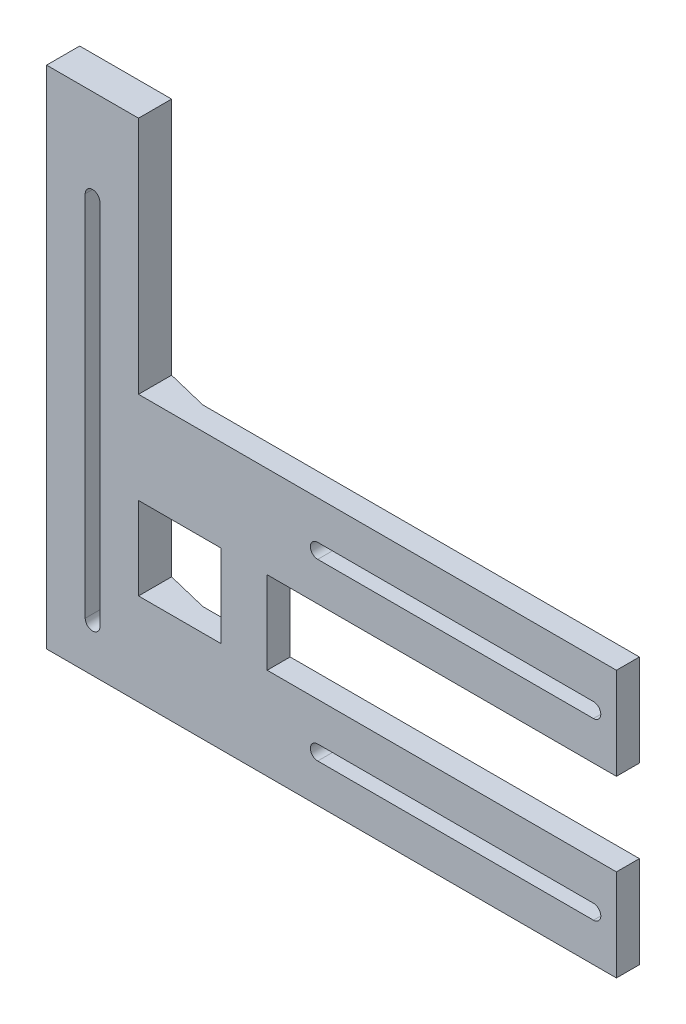
ISO-10303-21;
HEADER;
FILE_DESCRIPTION(('STEP AP214'),'2;1');
FILE_NAME('part.step','',(''),(''),'','','');
FILE_SCHEMA(('AUTOMOTIVE_DESIGN { 1 0 10303 214 1 1 1 1 }'));
ENDSEC;
DATA;
#1=APPLICATION_CONTEXT('core data for automotive mechanical design processes');
#2=APPLICATION_PROTOCOL_DEFINITION('international standard','automotive_design',2000,#1);
#3=PRODUCT_CONTEXT('',#1,'mechanical');
#4=PRODUCT('Part','Part','',(#3));
#5=PRODUCT_RELATED_PRODUCT_CATEGORY('part','',(#4));
#6=PRODUCT_DEFINITION_FORMATION('','',#4);
#7=PRODUCT_DEFINITION_CONTEXT('part definition',#1,'design');
#8=PRODUCT_DEFINITION('design','',#6,#7);
#9=PRODUCT_DEFINITION_SHAPE('','',#8);
#10=(LENGTH_UNIT() NAMED_UNIT(*) SI_UNIT(.MILLI.,.METRE.));
#11=(NAMED_UNIT(*) PLANE_ANGLE_UNIT() SI_UNIT($,.RADIAN.));
#12=(NAMED_UNIT(*) SI_UNIT($,.STERADIAN.) SOLID_ANGLE_UNIT());
#13=UNCERTAINTY_MEASURE_WITH_UNIT(LENGTH_MEASURE(1.E-05),#10,'distance_accuracy_value','');
#14=(GEOMETRIC_REPRESENTATION_CONTEXT(3) GLOBAL_UNCERTAINTY_ASSIGNED_CONTEXT((#13)) GLOBAL_UNIT_ASSIGNED_CONTEXT((#10,
#11,#12)) REPRESENTATION_CONTEXT('',''));
#15=CARTESIAN_POINT('',(0.,0.,0.));
#16=DIRECTION('',(0.,0.,1.));
#17=DIRECTION('',(1.,0.,0.));
#18=AXIS2_PLACEMENT_3D('',#15,#16,#17);
#19=CARTESIAN_POINT('',(-75.1345300278278,0.,5.));
#20=DIRECTION('',(-1.,0.,0.));
#21=DIRECTION('',(0.,0.,1.));
#22=AXIS2_PLACEMENT_3D('',#19,#20,#21);
#23=PLANE('',#22);
#24=DIRECTION('',(0.,-1.,0.));
#25=VECTOR('',#24,1.);
#26=CARTESIAN_POINT('',(-75.1345300278278,74.406088819695,-2.2));
#27=LINE('',#26,#25);
#28=CARTESIAN_POINT('',(-75.1345300278278,2.36446699289193,-2.2));
#29=VERTEX_POINT('',#28);
#30=CARTESIAN_POINT('',(-75.1345300278278,-15.6355330071064,-2.2));
#31=VERTEX_POINT('',#30);
#32=EDGE_CURVE('E530',#29,#31,#27,.T.);
#33=ORIENTED_EDGE('',*,*,#32,.F.);
#34=DIRECTION('',(0.,0.,-1.));
#35=VECTOR('',#34,1.);
#36=CARTESIAN_POINT('',(-75.1345300278278,2.36446699289274,5.));
#37=LINE('',#36,#35);
#38=CARTESIAN_POINT('',(-75.1345300278278,2.36446699289274,5.));
#39=VERTEX_POINT('',#38);
#40=EDGE_CURVE('E13',#39,#29,#37,.T.);
#41=ORIENTED_EDGE('',*,*,#40,.F.);
#42=DIRECTION('',(0.,1.,0.));
#43=VECTOR('',#42,1.);
#44=CARTESIAN_POINT('',(-75.1345300278278,0.,5.));
#45=LINE('',#44,#43);
#46=CARTESIAN_POINT('',(-75.1345300278278,-15.6355330071088,5.));
#47=VERTEX_POINT('',#46);
#48=EDGE_CURVE('E624',#47,#39,#45,.T.);
#49=ORIENTED_EDGE('',*,*,#48,.F.);
#50=DIRECTION('',(0.,0.,-1.));
#51=VECTOR('',#50,1.);
#52=CARTESIAN_POINT('',(-75.1345300278278,-15.6355330071088,5.));
#53=LINE('',#52,#51);
#54=EDGE_CURVE('E481',#47,#31,#53,.T.);
#55=ORIENTED_EDGE('',*,*,#54,.T.);
#56=EDGE_LOOP('',(#33,#41,#49,#55));
#57=FACE_BOUND('',#56,.T.);
#58=ADVANCED_FACE('F259',(#57),#23,.F.);
#59=DIRECTION('',(0.,0.,-1.));
#60=VECTOR('',#59,1.);
#61=CARTESIAN_POINT('',(-75.1345300278278,22.3644669928919,5.));
#62=LINE('',#61,#60);
#63=CARTESIAN_POINT('',(-75.1345300278278,22.3644669928919,5.));
#64=VERTEX_POINT('',#63);
#65=CARTESIAN_POINT('',(-75.1345300278278,22.3644669928919,-2.2));
#66=VERTEX_POINT('',#65);
#67=EDGE_CURVE('E489',#64,#66,#62,.T.);
#68=ORIENTED_EDGE('',*,*,#67,.T.);
#69=CARTESIAN_POINT('',(-75.1345300278278,74.406088819695,-2.2));
#70=VERTEX_POINT('',#69);
#71=EDGE_CURVE('E532',#70,#66,#27,.T.);
#72=ORIENTED_EDGE('',*,*,#71,.F.);
#73=DIRECTION('',(0.,0.,-1.));
#74=VECTOR('',#73,1.);
#75=CARTESIAN_POINT('',(-75.1345300278278,74.406088819695,5.));
#76=LINE('',#75,#74);
#77=CARTESIAN_POINT('',(-75.1345300278278,74.406088819695,5.));
#78=VERTEX_POINT('',#77);
#79=EDGE_CURVE('E487',#78,#70,#76,.T.);
#80=ORIENTED_EDGE('',*,*,#79,.F.);
#81=DIRECTION('',(0.,1.,0.));
#82=VECTOR('',#81,1.);
#83=CARTESIAN_POINT('',(-75.1345300278278,0.,5.));
#84=LINE('',#83,#82);
#85=EDGE_CURVE('E622',#64,#78,#84,.T.);
#86=ORIENTED_EDGE('',*,*,#85,.F.);
#87=EDGE_LOOP('',(#68,#72,#80,#86));
#88=FACE_BOUND('',#87,.T.);
#89=ADVANCED_FACE('F761',(#88),#23,.F.);
#90=CARTESIAN_POINT('',(0.,0.,0.));
#91=DIRECTION('',(0.,0.,1.));
#92=DIRECTION('',(1.,0.,0.));
#93=AXIS2_PLACEMENT_3D('',#90,#91,#92);
#94=PLANE('',#93);
#95=CARTESIAN_POINT('',(-36.1345300278285,12.3644669928919,0.));
#96=DIRECTION('',(0.,0.,1.));
#97=DIRECTION('',(1.,0.,0.));
#98=AXIS2_PLACEMENT_3D('',#95,#96,#97);
#99=CIRCLE('',#98,1.6);
#100=CARTESIAN_POINT('',(-36.1345300278285,13.9644669928919,0.));
#101=VERTEX_POINT('',#100);
#102=CARTESIAN_POINT('',(-36.1345300278285,10.7644669928919,0.));
#103=VERTEX_POINT('',#102);
#104=EDGE_CURVE('E584',#101,#103,#99,.T.);
#105=ORIENTED_EDGE('',*,*,#104,.T.);
#106=DIRECTION('',(1.,0.,0.));
#107=VECTOR('',#106,1.);
#108=CARTESIAN_POINT('',(-36.1345300278285,10.7644669928919,0.));
#109=LINE('',#108,#107);
#110=CARTESIAN_POINT('',(23.8654699721715,10.7644669928919,0.));
#111=VERTEX_POINT('',#110);
#112=EDGE_CURVE('E574',#103,#111,#109,.T.);
#113=ORIENTED_EDGE('',*,*,#112,.T.);
#114=CARTESIAN_POINT('',(23.8654699721715,12.3644669928919,0.));
#115=DIRECTION('',(0.,0.,1.));
#116=DIRECTION('',(1.,0.,0.));
#117=AXIS2_PLACEMENT_3D('',#114,#115,#116);
#118=CIRCLE('',#117,1.6);
#119=CARTESIAN_POINT('',(23.8654699721715,13.9644669928919,0.));
#120=VERTEX_POINT('',#119);
#121=EDGE_CURVE('E595',#111,#120,#118,.T.);
#122=ORIENTED_EDGE('',*,*,#121,.T.);
#123=DIRECTION('',(1.,0.,0.));
#124=VECTOR('',#123,1.);
#125=CARTESIAN_POINT('',(-36.1345300278285,13.9644669928919,0.));
#126=LINE('',#125,#124);
#127=EDGE_CURVE('E577',#101,#120,#126,.T.);
#128=ORIENTED_EDGE('',*,*,#127,.F.);
#129=EDGE_LOOP('',(#105,#113,#122,#128));
#130=FACE_BOUND('',#129,.T.);
#131=CARTESIAN_POINT('',(-36.1345300278278,-25.6355330071064,0.));
#132=DIRECTION('',(0.,0.,1.));
#133=DIRECTION('',(1.,0.,0.));
#134=AXIS2_PLACEMENT_3D('',#131,#132,#133);
#135=CIRCLE('',#134,1.6);
#136=CARTESIAN_POINT('',(-36.1345300278278,-24.0355330071064,0.));
#137=VERTEX_POINT('',#136);
#138=CARTESIAN_POINT('',(-36.1345300278278,-27.2355330071064,0.));
#139=VERTEX_POINT('',#138);
#140=EDGE_CURVE('E554',#137,#139,#135,.T.);
#141=ORIENTED_EDGE('',*,*,#140,.T.);
#142=DIRECTION('',(1.,0.,0.));
#143=VECTOR('',#142,1.);
#144=CARTESIAN_POINT('',(-36.1345300278278,-27.2355330071064,0.));
#145=LINE('',#144,#143);
#146=CARTESIAN_POINT('',(23.8654699721722,-27.2355330071064,0.));
#147=VERTEX_POINT('',#146);
#148=EDGE_CURVE('E542',#139,#147,#145,.T.);
#149=ORIENTED_EDGE('',*,*,#148,.T.);
#150=CARTESIAN_POINT('',(23.8654699721722,-25.6355330071064,0.));
#151=DIRECTION('',(0.,0.,1.));
#152=DIRECTION('',(1.,0.,0.));
#153=AXIS2_PLACEMENT_3D('',#150,#151,#152);
#154=CIRCLE('',#153,1.6);
#155=CARTESIAN_POINT('',(23.8654699721722,-24.0355330071064,0.));
#156=VERTEX_POINT('',#155);
#157=EDGE_CURVE('E564',#147,#156,#154,.T.);
#158=ORIENTED_EDGE('',*,*,#157,.T.);
#159=DIRECTION('',(1.,0.,0.));
#160=VECTOR('',#159,1.);
#161=CARTESIAN_POINT('',(-36.1345300278278,-24.0355330071064,0.));
#162=LINE('',#161,#160);
#163=EDGE_CURVE('E545',#137,#156,#162,.T.);
#164=ORIENTED_EDGE('',*,*,#163,.F.);
#165=EDGE_LOOP('',(#141,#149,#158,#164));
#166=FACE_BOUND('',#165,.T.);
#167=DIRECTION('',(-1.,0.,0.));
#168=VECTOR('',#167,1.);
#169=CARTESIAN_POINT('',(0.,2.36446699289274,0.));
#170=LINE('',#169,#168);
#171=CARTESIAN_POINT('',(-57.1345300278278,2.36446699289274,0.));
#172=VERTEX_POINT('',#171);
#173=CARTESIAN_POINT('',(-66.1345300278278,2.36446699289193,0.));
#174=VERTEX_POINT('',#173);
#175=EDGE_CURVE('E463',#172,#174,#170,.T.);
#176=ORIENTED_EDGE('',*,*,#175,.T.);
#177=DIRECTION('',(0.,-1.,0.));
#178=VECTOR('',#177,1.);
#179=CARTESIAN_POINT('',(-66.1345300278278,0.,0.));
#180=LINE('',#179,#178);
#181=CARTESIAN_POINT('',(-66.1345300278278,22.3644669928919,0.));
#182=VERTEX_POINT('',#181);
#183=EDGE_CURVE('E448',#174,#182,#180,.F.);
#184=ORIENTED_EDGE('',*,*,#183,.T.);
#185=DIRECTION('',(-1.,0.,0.));
#186=VECTOR('',#185,1.);
#187=CARTESIAN_POINT('',(0.,22.3644669928919,0.));
#188=LINE('',#187,#186);
#189=CARTESIAN_POINT('',(28.8654699721715,22.3644669928919,0.));
#190=VERTEX_POINT('',#189);
#191=EDGE_CURVE('E470',#190,#182,#188,.T.);
#192=ORIENTED_EDGE('',*,*,#191,.F.);
#193=DIRECTION('',(0.,-1.,0.));
#194=VECTOR('',#193,1.);
#195=CARTESIAN_POINT('',(28.8654699721715,0.,0.));
#196=LINE('',#195,#194);
#197=CARTESIAN_POINT('',(28.8654699721715,2.36446699289274,0.));
#198=VERTEX_POINT('',#197);
#199=EDGE_CURVE('E474',#190,#198,#196,.T.);
#200=ORIENTED_EDGE('',*,*,#199,.T.);
#201=DIRECTION('',(-1.,0.,0.));
#202=VECTOR('',#201,1.);
#203=CARTESIAN_POINT('',(0.,2.36446699289274,0.));
#204=LINE('',#203,#202);
#205=CARTESIAN_POINT('',(-47.1345300278284,2.36446699289274,0.));
#206=VERTEX_POINT('',#205);
#207=EDGE_CURVE('E642',#198,#206,#204,.T.);
#208=ORIENTED_EDGE('',*,*,#207,.T.);
#209=DIRECTION('',(0.,1.,0.));
#210=VECTOR('',#209,1.);
#211=CARTESIAN_POINT('',(-47.1345300278284,0.,0.));
#212=LINE('',#211,#210);
#213=CARTESIAN_POINT('',(-47.1345300278284,-15.6355330071088,0.));
#214=VERTEX_POINT('',#213);
#215=EDGE_CURVE('E639',#214,#206,#212,.T.);
#216=ORIENTED_EDGE('',*,*,#215,.F.);
#217=DIRECTION('',(-1.,0.,0.));
#218=VECTOR('',#217,1.);
#219=CARTESIAN_POINT('',(0.,-15.6355330071088,0.));
#220=LINE('',#219,#218);
#221=CARTESIAN_POINT('',(28.8654699721722,-15.6355330071088,0.));
#222=VERTEX_POINT('',#221);
#223=EDGE_CURVE('E636',#222,#214,#220,.T.);
#224=ORIENTED_EDGE('',*,*,#223,.F.);
#225=DIRECTION('',(0.,1.,0.));
#226=VECTOR('',#225,1.);
#227=CARTESIAN_POINT('',(28.8654699721722,0.,0.));
#228=LINE('',#227,#226);
#229=CARTESIAN_POINT('',(28.8654699721722,-35.6355330071064,0.));
#230=VERTEX_POINT('',#229);
#231=EDGE_CURVE('E634',#230,#222,#228,.T.);
#232=ORIENTED_EDGE('',*,*,#231,.F.);
#233=DIRECTION('',(-1.,0.,0.));
#234=VECTOR('',#233,1.);
#235=CARTESIAN_POINT('',(0.,-35.6355330071064,0.));
#236=LINE('',#235,#234);
#237=CARTESIAN_POINT('',(-66.1345300278274,-35.6355330071064,1.02782365951626E-13));
#238=VERTEX_POINT('',#237);
#239=EDGE_CURVE('E603',#230,#238,#236,.T.);
#240=ORIENTED_EDGE('',*,*,#239,.T.);
#241=DIRECTION('',(0.,1.,0.));
#242=VECTOR('',#241,1.);
#243=CARTESIAN_POINT('',(-66.1345300278278,0.,0.));
#244=LINE('',#243,#242);
#245=CARTESIAN_POINT('',(-66.1345300278274,-15.6355330071064,1.02782365951626E-13));
#246=VERTEX_POINT('',#245);
#247=EDGE_CURVE('E675',#238,#246,#244,.T.);
#248=ORIENTED_EDGE('',*,*,#247,.T.);
#249=DIRECTION('',(-1.,0.,0.));
#250=VECTOR('',#249,1.);
#251=CARTESIAN_POINT('',(0.,-15.6355330071088,0.));
#252=LINE('',#251,#250);
#253=CARTESIAN_POINT('',(-57.1345300278278,-15.6355330071088,0.));
#254=VERTEX_POINT('',#253);
#255=EDGE_CURVE('E472',#254,#246,#252,.T.);
#256=ORIENTED_EDGE('',*,*,#255,.F.);
#257=DIRECTION('',(0.,1.,0.));
#258=VECTOR('',#257,1.);
#259=CARTESIAN_POINT('',(-57.1345300278278,0.,0.));
#260=LINE('',#259,#258);
#261=EDGE_CURVE('E469',#254,#172,#260,.T.);
#262=ORIENTED_EDGE('',*,*,#261,.T.);
#263=EDGE_LOOP('',(#176,#184,#192,#200,#208,#216,#224,#232,#240,#248,#256,#262));
#264=FACE_BOUND('',#263,.T.);
#265=ADVANCED_FACE('F466',(#130,#166,#264),#94,.F.);
#266=CARTESIAN_POINT('',(0.,0.,5.));
#267=DIRECTION('',(0.,0.,1.));
#268=DIRECTION('',(1.,0.,0.));
#269=AXIS2_PLACEMENT_3D('',#266,#267,#268);
#270=PLANE('',#269);
#271=CARTESIAN_POINT('',(-85.1345300278278,54.3644669928936,5.));
#272=DIRECTION('',(0.,0.,1.));
#273=DIRECTION('',(1.,0.,0.));
#274=AXIS2_PLACEMENT_3D('',#271,#272,#273);
#275=CIRCLE('',#274,1.59999999999999);
#276=CARTESIAN_POINT('',(-83.5345300278278,54.3644669928936,5.));
#277=VERTEX_POINT('',#276);
#278=CARTESIAN_POINT('',(-86.7345300278278,54.3644669928936,5.));
#279=VERTEX_POINT('',#278);
#280=EDGE_CURVE('E723',#277,#279,#275,.T.);
#281=ORIENTED_EDGE('',*,*,#280,.F.);
#282=DIRECTION('',(0.,1.,0.));
#283=VECTOR('',#282,1.);
#284=CARTESIAN_POINT('',(-83.5345300278277,-25.6355330071064,5.));
#285=LINE('',#284,#283);
#286=CARTESIAN_POINT('',(-83.5345300278278,-25.6355330071064,5.));
#287=VERTEX_POINT('',#286);
#288=EDGE_CURVE('E677',#287,#277,#285,.T.);
#289=ORIENTED_EDGE('',*,*,#288,.F.);
#290=CARTESIAN_POINT('',(-85.1345300278278,-25.6355330071064,5.));
#291=DIRECTION('',(0.,0.,1.));
#292=DIRECTION('',(1.,0.,0.));
#293=AXIS2_PLACEMENT_3D('',#290,#291,#292);
#294=CIRCLE('',#293,1.59999999999999);
#295=CARTESIAN_POINT('',(-86.7345300278278,-25.6355330071064,5.));
#296=VERTEX_POINT('',#295);
#297=EDGE_CURVE('E714',#296,#287,#294,.T.);
#298=ORIENTED_EDGE('',*,*,#297,.F.);
#299=DIRECTION('',(0.,1.,0.));
#300=VECTOR('',#299,1.);
#301=CARTESIAN_POINT('',(-86.7345300278278,-25.6355330071064,5.));
#302=LINE('',#301,#300);
#303=EDGE_CURVE('E709',#296,#279,#302,.T.);
#304=ORIENTED_EDGE('',*,*,#303,.T.);
#305=EDGE_LOOP('',(#281,#289,#298,#304));
#306=FACE_BOUND('',#305,.T.);
#307=DIRECTION('',(-1.,0.,0.));
#308=VECTOR('',#307,1.);
#309=CARTESIAN_POINT('',(0.,22.3644669928919,5.));
#310=LINE('',#309,#308);
#311=CARTESIAN_POINT('',(28.8654699721715,22.3644669928919,5.));
#312=VERTEX_POINT('',#311);
#313=EDGE_CURVE('E620',#312,#64,#310,.T.);
#314=ORIENTED_EDGE('',*,*,#313,.T.);
#315=ORIENTED_EDGE('',*,*,#85,.T.);
#316=DIRECTION('',(1.,0.,0.));
#317=VECTOR('',#316,1.);
#318=CARTESIAN_POINT('',(0.,74.406088819695,5.));
#319=LINE('',#318,#317);
#320=CARTESIAN_POINT('',(-95.1345300278278,74.406088819695,5.));
#321=VERTEX_POINT('',#320);
#322=EDGE_CURVE('E480',#321,#78,#319,.T.);
#323=ORIENTED_EDGE('',*,*,#322,.F.);
#324=DIRECTION('',(0.,1.,0.));
#325=VECTOR('',#324,1.);
#326=CARTESIAN_POINT('',(-95.1345300278278,0.,5.));
#327=LINE('',#326,#325);
#328=CARTESIAN_POINT('',(-95.1345300278278,-35.6355330071064,5.));
#329=VERTEX_POINT('',#328);
#330=EDGE_CURVE('E517',#329,#321,#327,.T.);
#331=ORIENTED_EDGE('',*,*,#330,.F.);
#332=DIRECTION('',(-1.,0.,0.));
#333=VECTOR('',#332,1.);
#334=CARTESIAN_POINT('',(0.,-35.6355330071064,5.));
#335=LINE('',#334,#333);
#336=CARTESIAN_POINT('',(28.8654699721722,-35.6355330071064,5.));
#337=VERTEX_POINT('',#336);
#338=EDGE_CURVE('E606',#337,#329,#335,.T.);
#339=ORIENTED_EDGE('',*,*,#338,.F.);
#340=DIRECTION('',(0.,1.,0.));
#341=VECTOR('',#340,1.);
#342=CARTESIAN_POINT('',(28.8654699721722,0.,5.));
#343=LINE('',#342,#341);
#344=CARTESIAN_POINT('',(28.8654699721722,-15.6355330071088,5.));
#345=VERTEX_POINT('',#344);
#346=EDGE_CURVE('E608',#337,#345,#343,.T.);
#347=ORIENTED_EDGE('',*,*,#346,.T.);
#348=DIRECTION('',(-1.,0.,0.));
#349=VECTOR('',#348,1.);
#350=CARTESIAN_POINT('',(0.,-15.6355330071088,5.));
#351=LINE('',#350,#349);
#352=CARTESIAN_POINT('',(-47.1345300278284,-15.6355330071088,5.));
#353=VERTEX_POINT('',#352);
#354=EDGE_CURVE('E610',#345,#353,#351,.T.);
#355=ORIENTED_EDGE('',*,*,#354,.T.);
#356=DIRECTION('',(0.,1.,0.));
#357=VECTOR('',#356,1.);
#358=CARTESIAN_POINT('',(-47.1345300278284,0.,5.));
#359=LINE('',#358,#357);
#360=CARTESIAN_POINT('',(-47.1345300278284,2.36446699289274,5.));
#361=VERTEX_POINT('',#360);
#362=EDGE_CURVE('E612',#353,#361,#359,.T.);
#363=ORIENTED_EDGE('',*,*,#362,.T.);
#364=DIRECTION('',(-1.,0.,0.));
#365=VECTOR('',#364,1.);
#366=CARTESIAN_POINT('',(0.,2.36446699289274,5.));
#367=LINE('',#366,#365);
#368=CARTESIAN_POINT('',(28.8654699721715,2.36446699289274,5.));
#369=VERTEX_POINT('',#368);
#370=EDGE_CURVE('E615',#369,#361,#367,.T.);
#371=ORIENTED_EDGE('',*,*,#370,.F.);
#372=DIRECTION('',(0.,-1.,0.));
#373=VECTOR('',#372,1.);
#374=CARTESIAN_POINT('',(28.8654699721715,0.,5.));
#375=LINE('',#374,#373);
#376=EDGE_CURVE('E617',#312,#369,#375,.T.);
#377=ORIENTED_EDGE('',*,*,#376,.F.);
#378=EDGE_LOOP('',(#314,#315,#323,#331,#339,#347,#355,#363,#371,#377));
#379=FACE_BOUND('',#378,.T.);
#380=DIRECTION('',(-1.,0.,0.));
#381=VECTOR('',#380,1.);
#382=CARTESIAN_POINT('',(0.,2.36446699289274,5.));
#383=LINE('',#382,#381);
#384=CARTESIAN_POINT('',(-57.1345300278278,2.36446699289274,5.));
#385=VERTEX_POINT('',#384);
#386=EDGE_CURVE('E626',#385,#39,#383,.T.);
#387=ORIENTED_EDGE('',*,*,#386,.F.);
#388=DIRECTION('',(0.,1.,0.));
#389=VECTOR('',#388,1.);
#390=CARTESIAN_POINT('',(-57.1345300278278,0.,5.));
#391=LINE('',#390,#389);
#392=CARTESIAN_POINT('',(-57.1345300278278,-15.6355330071088,5.));
#393=VERTEX_POINT('',#392);
#394=EDGE_CURVE('E628',#393,#385,#391,.T.);
#395=ORIENTED_EDGE('',*,*,#394,.F.);
#396=DIRECTION('',(-1.,0.,0.));
#397=VECTOR('',#396,1.);
#398=CARTESIAN_POINT('',(0.,-15.6355330071088,5.));
#399=LINE('',#398,#397);
#400=EDGE_CURVE('E490',#393,#47,#399,.T.);
#401=ORIENTED_EDGE('',*,*,#400,.T.);
#402=ORIENTED_EDGE('',*,*,#48,.T.);
#403=EDGE_LOOP('',(#387,#395,#401,#402));
#404=FACE_BOUND('',#403,.T.);
#405=DIRECTION('',(1.,0.,0.));
#406=VECTOR('',#405,1.);
#407=CARTESIAN_POINT('',(-36.1345300278278,-24.0355330071064,5.));
#408=LINE('',#407,#406);
#409=CARTESIAN_POINT('',(-36.1345300278278,-24.0355330071064,5.));
#410=VERTEX_POINT('',#409);
#411=CARTESIAN_POINT('',(23.8654699721722,-24.0355330071064,5.));
#412=VERTEX_POINT('',#411);
#413=EDGE_CURVE('E548',#410,#412,#408,.T.);
#414=ORIENTED_EDGE('',*,*,#413,.T.);
#415=CARTESIAN_POINT('',(23.8654699721722,-25.6355330071064,5.));
#416=DIRECTION('',(0.,0.,1.));
#417=DIRECTION('',(1.,0.,0.));
#418=AXIS2_PLACEMENT_3D('',#415,#416,#417);
#419=CIRCLE('',#418,1.59999999999999);
#420=CARTESIAN_POINT('',(23.8654699721722,-27.2355330071064,5.));
#421=VERTEX_POINT('',#420);
#422=EDGE_CURVE('E561',#421,#412,#419,.T.);
#423=ORIENTED_EDGE('',*,*,#422,.F.);
#424=DIRECTION('',(1.,0.,0.));
#425=VECTOR('',#424,1.);
#426=CARTESIAN_POINT('',(-36.1345300278278,-27.2355330071064,5.));
#427=LINE('',#426,#425);
#428=CARTESIAN_POINT('',(-36.1345300278278,-27.2355330071064,5.));
#429=VERTEX_POINT('',#428);
#430=EDGE_CURVE('E540',#429,#421,#427,.T.);
#431=ORIENTED_EDGE('',*,*,#430,.F.);
#432=CARTESIAN_POINT('',(-36.1345300278278,-25.6355330071064,5.));
#433=DIRECTION('',(0.,0.,1.));
#434=DIRECTION('',(1.,0.,0.));
#435=AXIS2_PLACEMENT_3D('',#432,#433,#434);
#436=CIRCLE('',#435,1.59999999999999);
#437=EDGE_CURVE('E551',#410,#429,#436,.T.);
#438=ORIENTED_EDGE('',*,*,#437,.F.);
#439=EDGE_LOOP('',(#414,#423,#431,#438));
#440=FACE_BOUND('',#439,.T.);
#441=CARTESIAN_POINT('',(-36.1345300278285,12.3644669928919,5.));
#442=DIRECTION('',(0.,0.,1.));
#443=DIRECTION('',(1.,0.,0.));
#444=AXIS2_PLACEMENT_3D('',#441,#442,#443);
#445=CIRCLE('',#444,1.59999999999999);
#446=CARTESIAN_POINT('',(-36.1345300278285,13.9644669928919,5.));
#447=VERTEX_POINT('',#446);
#448=CARTESIAN_POINT('',(-36.1345300278285,10.7644669928919,5.));
#449=VERTEX_POINT('',#448);
#450=EDGE_CURVE('E582',#447,#449,#445,.T.);
#451=ORIENTED_EDGE('',*,*,#450,.F.);
#452=DIRECTION('',(1.,0.,0.));
#453=VECTOR('',#452,1.);
#454=CARTESIAN_POINT('',(-36.1345300278285,13.9644669928919,5.));
#455=LINE('',#454,#453);
#456=CARTESIAN_POINT('',(23.8654699721715,13.9644669928919,5.));
#457=VERTEX_POINT('',#456);
#458=EDGE_CURVE('E579',#447,#457,#455,.T.);
#459=ORIENTED_EDGE('',*,*,#458,.T.);
#460=CARTESIAN_POINT('',(23.8654699721715,12.3644669928919,5.));
#461=DIRECTION('',(0.,0.,1.));
#462=DIRECTION('',(1.,0.,0.));
#463=AXIS2_PLACEMENT_3D('',#460,#461,#462);
#464=CIRCLE('',#463,1.59999999999999);
#465=CARTESIAN_POINT('',(23.8654699721715,10.7644669928919,5.));
#466=VERTEX_POINT('',#465);
#467=EDGE_CURVE('E592',#466,#457,#464,.T.);
#468=ORIENTED_EDGE('',*,*,#467,.F.);
#469=DIRECTION('',(1.,0.,0.));
#470=VECTOR('',#469,1.);
#471=CARTESIAN_POINT('',(-36.1345300278285,10.7644669928919,5.));
#472=LINE('',#471,#470);
#473=EDGE_CURVE('E572',#449,#466,#472,.T.);
#474=ORIENTED_EDGE('',*,*,#473,.F.);
#475=EDGE_LOOP('',(#451,#459,#468,#474));
#476=FACE_BOUND('',#475,.T.);
#477=ADVANCED_FACE('F689',(#306,#379,#404,#440,#476),#270,.T.);
#478=CARTESIAN_POINT('',(0.,2.36446699289274,5.));
#479=DIRECTION('',(0.,-1.,0.));
#480=DIRECTION('',(0.,0.,-1.));
#481=AXIS2_PLACEMENT_3D('',#478,#479,#480);
#482=PLANE('',#481);
#483=ORIENTED_EDGE('',*,*,#175,.F.);
#484=DIRECTION('',(0.,0.,-1.));
#485=VECTOR('',#484,1.);
#486=CARTESIAN_POINT('',(-57.1345300278278,2.36446699289274,5.));
#487=LINE('',#486,#485);
#488=EDGE_CURVE('E268',#385,#172,#487,.T.);
#489=ORIENTED_EDGE('',*,*,#488,.F.);
#490=ORIENTED_EDGE('',*,*,#386,.T.);
#491=ORIENTED_EDGE('',*,*,#40,.T.);
#492=DIRECTION('',(0.971399006496777,0.,0.23745309047699));
#493=VECTOR('',#492,1.);
#494=CARTESIAN_POINT('',(-75.1345300278278,2.36446699289193,-2.2));
#495=LINE('',#494,#493);
#496=EDGE_CURVE('E451',#29,#174,#495,.T.);
#497=ORIENTED_EDGE('',*,*,#496,.T.);
#498=EDGE_LOOP('',(#483,#489,#490,#491,#497));
#499=FACE_BOUND('',#498,.T.);
#500=ADVANCED_FACE('F462',(#499),#482,.T.);
#501=CARTESIAN_POINT('',(-57.1345300278278,0.,5.));
#502=DIRECTION('',(-1.,0.,0.));
#503=DIRECTION('',(0.,0.,1.));
#504=AXIS2_PLACEMENT_3D('',#501,#502,#503);
#505=PLANE('',#504);
#506=ORIENTED_EDGE('',*,*,#261,.F.);
#507=DIRECTION('',(0.,0.,-1.));
#508=VECTOR('',#507,1.);
#509=CARTESIAN_POINT('',(-57.1345300278278,-15.6355330071088,5.));
#510=LINE('',#509,#508);
#511=EDGE_CURVE('E484',#393,#254,#510,.T.);
#512=ORIENTED_EDGE('',*,*,#511,.F.);
#513=ORIENTED_EDGE('',*,*,#394,.T.);
#514=ORIENTED_EDGE('',*,*,#488,.T.);
#515=EDGE_LOOP('',(#506,#512,#513,#514));
#516=FACE_BOUND('',#515,.T.);
#517=ADVANCED_FACE('F686',(#516),#505,.T.);
#518=CARTESIAN_POINT('',(0.,74.406088819695,5.));
#519=DIRECTION('',(0.,1.,0.));
#520=DIRECTION('',(0.,0.,1.));
#521=AXIS2_PLACEMENT_3D('',#518,#519,#520);
#522=PLANE('',#521);
#523=ORIENTED_EDGE('',*,*,#79,.T.);
#524=DIRECTION('',(1.,0.,0.));
#525=VECTOR('',#524,1.);
#526=CARTESIAN_POINT('',(-95.1345300278278,74.406088819695,-2.2));
#527=LINE('',#526,#525);
#528=CARTESIAN_POINT('',(-95.1345300278278,74.406088819695,-2.2));
#529=VERTEX_POINT('',#528);
#530=EDGE_CURVE('E522',#529,#70,#527,.T.);
#531=ORIENTED_EDGE('',*,*,#530,.F.);
#532=DIRECTION('',(0.,0.,-1.));
#533=VECTOR('',#532,1.);
#534=CARTESIAN_POINT('',(-95.1345300278278,74.406088819695,5.));
#535=LINE('',#534,#533);
#536=EDGE_CURVE('E263',#321,#529,#535,.T.);
#537=ORIENTED_EDGE('',*,*,#536,.F.);
#538=ORIENTED_EDGE('',*,*,#322,.T.);
#539=EDGE_LOOP('',(#523,#531,#537,#538));
#540=FACE_BOUND('',#539,.T.);
#541=ADVANCED_FACE('F261',(#540),#522,.T.);
#542=CARTESIAN_POINT('',(-95.1345300278278,0.,5.));
#543=DIRECTION('',(-1.,0.,0.));
#544=DIRECTION('',(0.,0.,1.));
#545=AXIS2_PLACEMENT_3D('',#542,#543,#544);
#546=PLANE('',#545);
#547=ORIENTED_EDGE('',*,*,#536,.T.);
#548=DIRECTION('',(0.,1.,0.));
#549=VECTOR('',#548,1.);
#550=CARTESIAN_POINT('',(-95.1345300278278,74.406088819695,-2.2));
#551=LINE('',#550,#549);
#552=CARTESIAN_POINT('',(-95.1345300278278,-35.6355330071072,-2.2));
#553=VERTEX_POINT('',#552);
#554=EDGE_CURVE('E515',#553,#529,#551,.T.);
#555=ORIENTED_EDGE('',*,*,#554,.F.);
#556=DIRECTION('',(0.,0.,-1.));
#557=VECTOR('',#556,1.);
#558=CARTESIAN_POINT('',(-95.1345300278278,-35.6355330071064,5.));
#559=LINE('',#558,#557);
#560=EDGE_CURVE('E504',#329,#553,#559,.T.);
#561=ORIENTED_EDGE('',*,*,#560,.F.);
#562=ORIENTED_EDGE('',*,*,#330,.T.);
#563=EDGE_LOOP('',(#547,#555,#561,#562));
#564=FACE_BOUND('',#563,.T.);
#565=ADVANCED_FACE('F514',(#564),#546,.T.);
#566=CARTESIAN_POINT('',(0.,-35.6355330071064,5.));
#567=DIRECTION('',(0.,-1.,0.));
#568=DIRECTION('',(0.,0.,-1.));
#569=AXIS2_PLACEMENT_3D('',#566,#567,#568);
#570=PLANE('',#569);
#571=ORIENTED_EDGE('',*,*,#338,.T.);
#572=ORIENTED_EDGE('',*,*,#560,.T.);
#573=DIRECTION('',(-1.,0.,0.));
#574=VECTOR('',#573,1.);
#575=CARTESIAN_POINT('',(-95.1345300278278,-35.6355330071072,-2.2));
#576=LINE('',#575,#574);
#577=CARTESIAN_POINT('',(-75.1345300278278,-35.6355330071072,-2.2));
#578=VERTEX_POINT('',#577);
#579=EDGE_CURVE('E538',#578,#553,#576,.T.);
#580=ORIENTED_EDGE('',*,*,#579,.F.);
#581=DIRECTION('',(0.971399006496778,0.,0.23745309047699));
#582=VECTOR('',#581,1.);
#583=CARTESIAN_POINT('',(-75.1345300278278,-35.6355330071064,-2.2));
#584=LINE('',#583,#582);
#585=EDGE_CURVE('E673',#578,#238,#584,.T.);
#586=ORIENTED_EDGE('',*,*,#585,.T.);
#587=ORIENTED_EDGE('',*,*,#239,.F.);
#588=DIRECTION('',(0.,0.,-1.));
#589=VECTOR('',#588,1.);
#590=CARTESIAN_POINT('',(28.8654699721722,-35.6355330071064,5.));
#591=LINE('',#590,#589);
#592=EDGE_CURVE('E503',#337,#230,#591,.T.);
#593=ORIENTED_EDGE('',*,*,#592,.F.);
#594=EDGE_LOOP('',(#571,#572,#580,#586,#587,#593));
#595=FACE_BOUND('',#594,.T.);
#596=ADVANCED_FACE('F671',(#595),#570,.T.);
#597=CARTESIAN_POINT('',(28.8654699721722,0.,5.));
#598=DIRECTION('',(-1.,0.,0.));
#599=DIRECTION('',(0.,0.,1.));
#600=AXIS2_PLACEMENT_3D('',#597,#598,#599);
#601=PLANE('',#600);
#602=ORIENTED_EDGE('',*,*,#231,.T.);
#603=DIRECTION('',(0.,0.,-1.));
#604=VECTOR('',#603,1.);
#605=CARTESIAN_POINT('',(28.8654699721722,-15.6355330071088,5.));
#606=LINE('',#605,#604);
#607=EDGE_CURVE('E500',#345,#222,#606,.T.);
#608=ORIENTED_EDGE('',*,*,#607,.F.);
#609=ORIENTED_EDGE('',*,*,#346,.F.);
#610=ORIENTED_EDGE('',*,*,#592,.T.);
#611=EDGE_LOOP('',(#602,#608,#609,#610));
#612=FACE_BOUND('',#611,.T.);
#613=ADVANCED_FACE('F669',(#612),#601,.F.);
#614=CARTESIAN_POINT('',(0.,-15.6355330071088,5.));
#615=DIRECTION('',(0.,-1.,0.));
#616=DIRECTION('',(0.,0.,-1.));
#617=AXIS2_PLACEMENT_3D('',#614,#615,#616);
#618=PLANE('',#617);
#619=ORIENTED_EDGE('',*,*,#223,.T.);
#620=DIRECTION('',(0.,0.,-1.));
#621=VECTOR('',#620,1.);
#622=CARTESIAN_POINT('',(-47.1345300278284,-15.6355330071088,5.));
#623=LINE('',#622,#621);
#624=EDGE_CURVE('E498',#353,#214,#623,.T.);
#625=ORIENTED_EDGE('',*,*,#624,.F.);
#626=ORIENTED_EDGE('',*,*,#354,.F.);
#627=ORIENTED_EDGE('',*,*,#607,.T.);
#628=EDGE_LOOP('',(#619,#625,#626,#627));
#629=FACE_BOUND('',#628,.T.);
#630=ADVANCED_FACE('F664',(#629),#618,.F.);
#631=CARTESIAN_POINT('',(-47.1345300278284,0.,5.));
#632=DIRECTION('',(-1.,0.,0.));
#633=DIRECTION('',(0.,0.,1.));
#634=AXIS2_PLACEMENT_3D('',#631,#632,#633);
#635=PLANE('',#634);
#636=ORIENTED_EDGE('',*,*,#215,.T.);
#637=DIRECTION('',(0.,0.,-1.));
#638=VECTOR('',#637,1.);
#639=CARTESIAN_POINT('',(-47.1345300278284,2.36446699289274,5.));
#640=LINE('',#639,#638);
#641=EDGE_CURVE('E496',#361,#206,#640,.T.);
#642=ORIENTED_EDGE('',*,*,#641,.F.);
#643=ORIENTED_EDGE('',*,*,#362,.F.);
#644=ORIENTED_EDGE('',*,*,#624,.T.);
#645=EDGE_LOOP('',(#636,#642,#643,#644));
#646=FACE_BOUND('',#645,.T.);
#647=ADVANCED_FACE('F658',(#646),#635,.F.);
#648=CARTESIAN_POINT('',(0.,2.36446699289274,5.));
#649=DIRECTION('',(0.,-1.,0.));
#650=DIRECTION('',(0.,0.,-1.));
#651=AXIS2_PLACEMENT_3D('',#648,#649,#650);
#652=PLANE('',#651);
#653=ORIENTED_EDGE('',*,*,#370,.T.);
#654=ORIENTED_EDGE('',*,*,#641,.T.);
#655=ORIENTED_EDGE('',*,*,#207,.F.);
#656=DIRECTION('',(0.,0.,-1.));
#657=VECTOR('',#656,1.);
#658=CARTESIAN_POINT('',(28.8654699721715,2.36446699289274,5.));
#659=LINE('',#658,#657);
#660=EDGE_CURVE('E494',#369,#198,#659,.T.);
#661=ORIENTED_EDGE('',*,*,#660,.F.);
#662=EDGE_LOOP('',(#653,#654,#655,#661));
#663=FACE_BOUND('',#662,.T.);
#664=ADVANCED_FACE('F654',(#663),#652,.T.);
#665=CARTESIAN_POINT('',(28.8654699721715,0.,5.));
#666=DIRECTION('',(1.,0.,0.));
#667=DIRECTION('',(0.,0.,-1.));
#668=AXIS2_PLACEMENT_3D('',#665,#666,#667);
#669=PLANE('',#668);
#670=ORIENTED_EDGE('',*,*,#199,.F.);
#671=DIRECTION('',(0.,0.,-1.));
#672=VECTOR('',#671,1.);
#673=CARTESIAN_POINT('',(28.8654699721715,22.3644669928919,5.));
#674=LINE('',#673,#672);
#675=EDGE_CURVE('E492',#312,#190,#674,.T.);
#676=ORIENTED_EDGE('',*,*,#675,.F.);
#677=ORIENTED_EDGE('',*,*,#376,.T.);
#678=ORIENTED_EDGE('',*,*,#660,.T.);
#679=EDGE_LOOP('',(#670,#676,#677,#678));
#680=FACE_BOUND('',#679,.T.);
#681=ADVANCED_FACE('F649',(#680),#669,.T.);
#682=CARTESIAN_POINT('',(0.,22.3644669928919,5.));
#683=DIRECTION('',(0.,-1.,0.));
#684=DIRECTION('',(0.,0.,-1.));
#685=AXIS2_PLACEMENT_3D('',#682,#683,#684);
#686=PLANE('',#685);
#687=ORIENTED_EDGE('',*,*,#191,.T.);
#688=DIRECTION('',(0.971399006496777,0.,0.23745309047699));
#689=VECTOR('',#688,1.);
#690=CARTESIAN_POINT('',(-75.1345300278278,22.3644669928919,-2.2));
#691=LINE('',#690,#689);
#692=EDGE_CURVE('E454',#66,#182,#691,.T.);
#693=ORIENTED_EDGE('',*,*,#692,.F.);
#694=ORIENTED_EDGE('',*,*,#67,.F.);
#695=ORIENTED_EDGE('',*,*,#313,.F.);
#696=ORIENTED_EDGE('',*,*,#675,.T.);
#697=EDGE_LOOP('',(#687,#693,#694,#695,#696));
#698=FACE_BOUND('',#697,.T.);
#699=ADVANCED_FACE('F698',(#698),#686,.F.);
#700=CARTESIAN_POINT('',(0.,-15.6355330071088,5.));
#701=DIRECTION('',(0.,-1.,0.));
#702=DIRECTION('',(0.,0.,-1.));
#703=AXIS2_PLACEMENT_3D('',#700,#701,#702);
#704=PLANE('',#703);
#705=ORIENTED_EDGE('',*,*,#255,.T.);
#706=DIRECTION('',(0.971399006496778,0.,0.23745309047699));
#707=VECTOR('',#706,1.);
#708=CARTESIAN_POINT('',(-75.1345300278278,-15.6355330071064,-2.2));
#709=LINE('',#708,#707);
#710=EDGE_CURVE('E459',#31,#246,#709,.T.);
#711=ORIENTED_EDGE('',*,*,#710,.F.);
#712=ORIENTED_EDGE('',*,*,#54,.F.);
#713=ORIENTED_EDGE('',*,*,#400,.F.);
#714=ORIENTED_EDGE('',*,*,#511,.T.);
#715=EDGE_LOOP('',(#705,#711,#712,#713,#714));
#716=FACE_BOUND('',#715,.T.);
#717=ADVANCED_FACE('F681',(#716),#704,.F.);
#718=CARTESIAN_POINT('',(23.8654699721715,12.3644669928919,5.));
#719=DIRECTION('',(0.,0.,1.));
#720=DIRECTION('',(1.,0.,0.));
#721=AXIS2_PLACEMENT_3D('',#718,#719,#720);
#722=CYLINDRICAL_SURFACE('',#721,1.59999999999999);
#723=ORIENTED_EDGE('',*,*,#121,.F.);
#724=DIRECTION('',(0.,0.,1.));
#725=VECTOR('',#724,1.);
#726=CARTESIAN_POINT('',(23.8654699721715,10.764466992892,5.));
#727=LINE('',#726,#725);
#728=EDGE_CURVE('E600',#466,#111,#727,.F.);
#729=ORIENTED_EDGE('',*,*,#728,.F.);
#730=ORIENTED_EDGE('',*,*,#467,.T.);
#731=DIRECTION('',(0.,0.,1.));
#732=VECTOR('',#731,1.);
#733=CARTESIAN_POINT('',(23.8654699721715,13.9644669928919,5.));
#734=LINE('',#733,#732);
#735=EDGE_CURVE('E598',#120,#457,#734,.T.);
#736=ORIENTED_EDGE('',*,*,#735,.F.);
#737=EDGE_LOOP('',(#723,#729,#730,#736));
#738=FACE_BOUND('',#737,.T.);
#739=ADVANCED_FACE('F799',(#738),#722,.F.);
#740=CARTESIAN_POINT('',(-36.1345300278285,12.3644669928919,5.));
#741=DIRECTION('',(0.,0.,1.));
#742=DIRECTION('',(1.,0.,0.));
#743=AXIS2_PLACEMENT_3D('',#740,#741,#742);
#744=CYLINDRICAL_SURFACE('',#743,1.59999999999999);
#745=ORIENTED_EDGE('',*,*,#450,.T.);
#746=DIRECTION('',(0.,0.,1.));
#747=VECTOR('',#746,1.);
#748=CARTESIAN_POINT('',(-36.1345300278285,10.7644669928919,5.));
#749=LINE('',#748,#747);
#750=EDGE_CURVE('E587',#103,#449,#749,.T.);
#751=ORIENTED_EDGE('',*,*,#750,.F.);
#752=ORIENTED_EDGE('',*,*,#104,.F.);
#753=DIRECTION('',(0.,0.,1.));
#754=VECTOR('',#753,1.);
#755=CARTESIAN_POINT('',(-36.1345300278285,13.9644669928919,5.));
#756=LINE('',#755,#754);
#757=EDGE_CURVE('E590',#447,#101,#756,.F.);
#758=ORIENTED_EDGE('',*,*,#757,.F.);
#759=EDGE_LOOP('',(#745,#751,#752,#758));
#760=FACE_BOUND('',#759,.T.);
#761=ADVANCED_FACE('F807',(#760),#744,.F.);
#762=CARTESIAN_POINT('',(-36.1345300278285,13.9644669928919,5.));
#763=DIRECTION('',(0.,1.,0.));
#764=DIRECTION('',(-1.,0.,0.));
#765=AXIS2_PLACEMENT_3D('',#762,#763,#764);
#766=PLANE('',#765);
#767=ORIENTED_EDGE('',*,*,#735,.T.);
#768=ORIENTED_EDGE('',*,*,#458,.F.);
#769=ORIENTED_EDGE('',*,*,#757,.T.);
#770=ORIENTED_EDGE('',*,*,#127,.T.);
#771=EDGE_LOOP('',(#767,#768,#769,#770));
#772=FACE_BOUND('',#771,.T.);
#773=ADVANCED_FACE('F811',(#772),#766,.F.);
#774=CARTESIAN_POINT('',(-36.1345300278285,10.7644669928919,5.));
#775=DIRECTION('',(0.,-1.,0.));
#776=DIRECTION('',(1.,0.,0.));
#777=AXIS2_PLACEMENT_3D('',#774,#775,#776);
#778=PLANE('',#777);
#779=ORIENTED_EDGE('',*,*,#728,.T.);
#780=ORIENTED_EDGE('',*,*,#112,.F.);
#781=ORIENTED_EDGE('',*,*,#750,.T.);
#782=ORIENTED_EDGE('',*,*,#473,.T.);
#783=EDGE_LOOP('',(#779,#780,#781,#782));
#784=FACE_BOUND('',#783,.T.);
#785=ADVANCED_FACE('F815',(#784),#778,.F.);
#786=CARTESIAN_POINT('',(23.8654699721722,-25.6355330071064,5.));
#787=DIRECTION('',(0.,0.,1.));
#788=DIRECTION('',(1.,0.,0.));
#789=AXIS2_PLACEMENT_3D('',#786,#787,#788);
#790=CYLINDRICAL_SURFACE('',#789,1.59999999999999);
#791=ORIENTED_EDGE('',*,*,#157,.F.);
#792=DIRECTION('',(0.,0.,1.));
#793=VECTOR('',#792,1.);
#794=CARTESIAN_POINT('',(23.8654699721722,-27.2355330071064,5.));
#795=LINE('',#794,#793);
#796=EDGE_CURVE('E569',#421,#147,#795,.F.);
#797=ORIENTED_EDGE('',*,*,#796,.F.);
#798=ORIENTED_EDGE('',*,*,#422,.T.);
#799=DIRECTION('',(0.,0.,1.));
#800=VECTOR('',#799,1.);
#801=CARTESIAN_POINT('',(23.8654699721722,-24.0355330071064,5.));
#802=LINE('',#801,#800);
#803=EDGE_CURVE('E567',#156,#412,#802,.T.);
#804=ORIENTED_EDGE('',*,*,#803,.F.);
#805=EDGE_LOOP('',(#791,#797,#798,#804));
#806=FACE_BOUND('',#805,.T.);
#807=ADVANCED_FACE('F819',(#806),#790,.F.);
#808=CARTESIAN_POINT('',(-36.1345300278278,-25.6355330071064,5.));
#809=DIRECTION('',(0.,0.,1.));
#810=DIRECTION('',(1.,0.,0.));
#811=AXIS2_PLACEMENT_3D('',#808,#809,#810);
#812=CYLINDRICAL_SURFACE('',#811,1.59999999999999);
#813=ORIENTED_EDGE('',*,*,#437,.T.);
#814=DIRECTION('',(0.,0.,1.));
#815=VECTOR('',#814,1.);
#816=CARTESIAN_POINT('',(-36.1345300278278,-27.2355330071064,5.));
#817=LINE('',#816,#815);
#818=EDGE_CURVE('E557',#139,#429,#817,.T.);
#819=ORIENTED_EDGE('',*,*,#818,.F.);
#820=ORIENTED_EDGE('',*,*,#140,.F.);
#821=DIRECTION('',(0.,0.,1.));
#822=VECTOR('',#821,1.);
#823=CARTESIAN_POINT('',(-36.1345300278278,-24.0355330071064,5.));
#824=LINE('',#823,#822);
#825=EDGE_CURVE('E559',#410,#137,#824,.F.);
#826=ORIENTED_EDGE('',*,*,#825,.F.);
#827=EDGE_LOOP('',(#813,#819,#820,#826));
#828=FACE_BOUND('',#827,.T.);
#829=ADVANCED_FACE('F823',(#828),#812,.F.);
#830=CARTESIAN_POINT('',(-36.1345300278278,-24.0355330071064,5.));
#831=DIRECTION('',(0.,1.,0.));
#832=DIRECTION('',(-1.,0.,0.));
#833=AXIS2_PLACEMENT_3D('',#830,#831,#832);
#834=PLANE('',#833);
#835=ORIENTED_EDGE('',*,*,#803,.T.);
#836=ORIENTED_EDGE('',*,*,#413,.F.);
#837=ORIENTED_EDGE('',*,*,#825,.T.);
#838=ORIENTED_EDGE('',*,*,#163,.T.);
#839=EDGE_LOOP('',(#835,#836,#837,#838));
#840=FACE_BOUND('',#839,.T.);
#841=ADVANCED_FACE('F757',(#840),#834,.F.);
#842=CARTESIAN_POINT('',(-36.1345300278278,-27.2355330071064,5.));
#843=DIRECTION('',(0.,-1.,0.));
#844=DIRECTION('',(1.,0.,0.));
#845=AXIS2_PLACEMENT_3D('',#842,#843,#844);
#846=PLANE('',#845);
#847=ORIENTED_EDGE('',*,*,#796,.T.);
#848=ORIENTED_EDGE('',*,*,#148,.F.);
#849=ORIENTED_EDGE('',*,*,#818,.T.);
#850=ORIENTED_EDGE('',*,*,#430,.T.);
#851=EDGE_LOOP('',(#847,#848,#849,#850));
#852=FACE_BOUND('',#851,.T.);
#853=ADVANCED_FACE('F748',(#852),#846,.F.);
#854=CARTESIAN_POINT('',(0.,0.,-2.2));
#855=DIRECTION('',(0.,0.,1.));
#856=DIRECTION('',(1.,0.,0.));
#857=AXIS2_PLACEMENT_3D('',#854,#855,#856);
#858=PLANE('',#857);
#859=DIRECTION('',(0.,1.,0.));
#860=VECTOR('',#859,1.);
#861=CARTESIAN_POINT('',(-83.5345300278278,-25.6355330071064,-2.2));
#862=LINE('',#861,#860);
#863=CARTESIAN_POINT('',(-83.5345300278278,-25.6355330071064,-2.2));
#864=VERTEX_POINT('',#863);
#865=CARTESIAN_POINT('',(-83.5345300278278,54.3644669928936,-2.2));
#866=VERTEX_POINT('',#865);
#867=EDGE_CURVE('E705',#864,#866,#862,.T.);
#868=ORIENTED_EDGE('',*,*,#867,.T.);
#869=CARTESIAN_POINT('',(-85.1345300278278,54.3644669928936,-2.2));
#870=DIRECTION('',(0.,0.,1.));
#871=DIRECTION('',(1.,0.,0.));
#872=AXIS2_PLACEMENT_3D('',#869,#870,#871);
#873=CIRCLE('',#872,1.6);
#874=CARTESIAN_POINT('',(-86.7345300278278,54.3644669928936,-2.2));
#875=VERTEX_POINT('',#874);
#876=EDGE_CURVE('E726',#866,#875,#873,.T.);
#877=ORIENTED_EDGE('',*,*,#876,.T.);
#878=DIRECTION('',(0.,1.,0.));
#879=VECTOR('',#878,1.);
#880=CARTESIAN_POINT('',(-86.7345300278278,-25.6355330071064,-2.2));
#881=LINE('',#880,#879);
#882=CARTESIAN_POINT('',(-86.7345300278278,-25.6355330071064,-2.2));
#883=VERTEX_POINT('',#882);
#884=EDGE_CURVE('E707',#883,#875,#881,.T.);
#885=ORIENTED_EDGE('',*,*,#884,.F.);
#886=CARTESIAN_POINT('',(-85.1345300278278,-25.6355330071064,-2.2));
#887=DIRECTION('',(0.,0.,1.));
#888=DIRECTION('',(1.,0.,0.));
#889=AXIS2_PLACEMENT_3D('',#886,#887,#888);
#890=CIRCLE('',#889,1.6);
#891=EDGE_CURVE('E716',#883,#864,#890,.T.);
#892=ORIENTED_EDGE('',*,*,#891,.T.);
#893=EDGE_LOOP('',(#868,#877,#885,#892));
#894=FACE_BOUND('',#893,.T.);
#895=ORIENTED_EDGE('',*,*,#71,.T.);
#896=EDGE_CURVE('E533',#66,#29,#27,.T.);
#897=ORIENTED_EDGE('',*,*,#896,.T.);
#898=ORIENTED_EDGE('',*,*,#32,.T.);
#899=EDGE_CURVE('E527',#31,#578,#27,.T.);
#900=ORIENTED_EDGE('',*,*,#899,.T.);
#901=ORIENTED_EDGE('',*,*,#579,.T.);
#902=ORIENTED_EDGE('',*,*,#554,.T.);
#903=ORIENTED_EDGE('',*,*,#530,.T.);
#904=EDGE_LOOP('',(#895,#897,#898,#900,#901,#902,#903));
#905=FACE_BOUND('',#904,.T.);
#906=ADVANCED_FACE('F695',(#894,#905),#858,.F.);
#907=CARTESIAN_POINT('',(-85.1345300278278,54.3644669928936,5.));
#908=DIRECTION('',(0.,0.,1.));
#909=DIRECTION('',(1.,0.,0.));
#910=AXIS2_PLACEMENT_3D('',#907,#908,#909);
#911=CYLINDRICAL_SURFACE('',#910,1.6);
#912=ORIENTED_EDGE('',*,*,#876,.F.);
#913=DIRECTION('',(0.,0.,-1.));
#914=VECTOR('',#913,1.);
#915=CARTESIAN_POINT('',(-83.5345300278278,54.3644669928936,-2.2));
#916=LINE('',#915,#914);
#917=EDGE_CURVE('E720',#277,#866,#916,.T.);
#918=ORIENTED_EDGE('',*,*,#917,.F.);
#919=ORIENTED_EDGE('',*,*,#280,.T.);
#920=DIRECTION('',(0.,0.,1.));
#921=VECTOR('',#920,1.);
#922=CARTESIAN_POINT('',(-86.7345300278278,54.3644669928936,5.));
#923=LINE('',#922,#921);
#924=EDGE_CURVE('E534',#875,#279,#923,.T.);
#925=ORIENTED_EDGE('',*,*,#924,.F.);
#926=EDGE_LOOP('',(#912,#918,#919,#925));
#927=FACE_BOUND('',#926,.T.);
#928=ADVANCED_FACE('F738',(#927),#911,.F.);
#929=CARTESIAN_POINT('',(-85.1345300278278,-25.6355330071064,5.));
#930=DIRECTION('',(0.,0.,1.));
#931=DIRECTION('',(1.,0.,0.));
#932=AXIS2_PLACEMENT_3D('',#929,#930,#931);
#933=CYLINDRICAL_SURFACE('',#932,1.6);
#934=ORIENTED_EDGE('',*,*,#297,.T.);
#935=DIRECTION('',(0.,0.,-1.));
#936=VECTOR('',#935,1.);
#937=CARTESIAN_POINT('',(-83.5345300278278,-25.6355330071064,-2.2));
#938=LINE('',#937,#936);
#939=EDGE_CURVE('E711',#287,#864,#938,.T.);
#940=ORIENTED_EDGE('',*,*,#939,.T.);
#941=ORIENTED_EDGE('',*,*,#891,.F.);
#942=DIRECTION('',(0.,0.,1.));
#943=VECTOR('',#942,1.);
#944=CARTESIAN_POINT('',(-86.7345300278278,-25.6355330071064,5.));
#945=LINE('',#944,#943);
#946=EDGE_CURVE('E282',#296,#883,#945,.F.);
#947=ORIENTED_EDGE('',*,*,#946,.F.);
#948=EDGE_LOOP('',(#934,#940,#941,#947));
#949=FACE_BOUND('',#948,.T.);
#950=ADVANCED_FACE('F743',(#949),#933,.F.);
#951=CARTESIAN_POINT('',(-86.7345300278278,-25.6355330071064,5.));
#952=DIRECTION('',(-1.,0.,0.));
#953=DIRECTION('',(0.,-1.,0.));
#954=AXIS2_PLACEMENT_3D('',#951,#952,#953);
#955=PLANE('',#954);
#956=ORIENTED_EDGE('',*,*,#924,.T.);
#957=ORIENTED_EDGE('',*,*,#303,.F.);
#958=ORIENTED_EDGE('',*,*,#946,.T.);
#959=ORIENTED_EDGE('',*,*,#884,.T.);
#960=EDGE_LOOP('',(#956,#957,#958,#959));
#961=FACE_BOUND('',#960,.T.);
#962=ADVANCED_FACE('F731',(#961),#955,.F.);
#963=CARTESIAN_POINT('',(-83.5345300278278,-25.6355330071064,-2.2));
#964=DIRECTION('',(1.,0.,0.));
#965=DIRECTION('',(0.,0.,-1.));
#966=AXIS2_PLACEMENT_3D('',#963,#964,#965);
#967=PLANE('',#966);
#968=ORIENTED_EDGE('',*,*,#917,.T.);
#969=ORIENTED_EDGE('',*,*,#867,.F.);
#970=ORIENTED_EDGE('',*,*,#939,.F.);
#971=ORIENTED_EDGE('',*,*,#288,.T.);
#972=EDGE_LOOP('',(#968,#969,#970,#971));
#973=FACE_BOUND('',#972,.T.);
#974=ADVANCED_FACE('F745',(#973),#967,.F.);
#975=CARTESIAN_POINT('',(-75.1345300278278,-35.6355330071064,-2.2));
#976=DIRECTION('',(0.23745309047699,0.,-0.971399006496778));
#977=DIRECTION('',(0.971399006496778,0.,0.23745309047699));
#978=AXIS2_PLACEMENT_3D('',#975,#976,#977);
#979=PLANE('',#978);
#980=ORIENTED_EDGE('',*,*,#247,.F.);
#981=ORIENTED_EDGE('',*,*,#585,.F.);
#982=ORIENTED_EDGE('',*,*,#899,.F.);
#983=ORIENTED_EDGE('',*,*,#710,.T.);
#984=EDGE_LOOP('',(#980,#981,#982,#983));
#985=FACE_BOUND('',#984,.T.);
#986=ADVANCED_FACE('F887',(#985),#979,.T.);
#987=CARTESIAN_POINT('',(-75.1345300278278,22.3644669928919,-2.2));
#988=DIRECTION('',(-0.23745309047699,0.,0.971399006496777));
#989=DIRECTION('',(0.971399006496777,0.,0.23745309047699));
#990=AXIS2_PLACEMENT_3D('',#987,#988,#989);
#991=PLANE('',#990);
#992=ORIENTED_EDGE('',*,*,#183,.F.);
#993=ORIENTED_EDGE('',*,*,#496,.F.);
#994=ORIENTED_EDGE('',*,*,#896,.F.);
#995=ORIENTED_EDGE('',*,*,#692,.T.);
#996=EDGE_LOOP('',(#992,#993,#994,#995));
#997=FACE_BOUND('',#996,.T.);
#998=ADVANCED_FACE('F449',(#997),#991,.F.);
#999=CLOSED_SHELL('',(#58,#89,#265,#477,#500,#517,#541,#565,#596,#613,#630,#647,#664,#681,#699,
#717,#739,#761,#773,#785,#807,#829,#841,#853,#906,#928,#950,#962,#974,#986,#998));
#1000=MANIFOLD_SOLID_BREP('B2',#999);
#1001=ADVANCED_BREP_SHAPE_REPRESENTATION('',(#18,#1000),#14);
#1002=SHAPE_DEFINITION_REPRESENTATION(#9,#1001);
ENDSEC;
END-ISO-10303-21;
